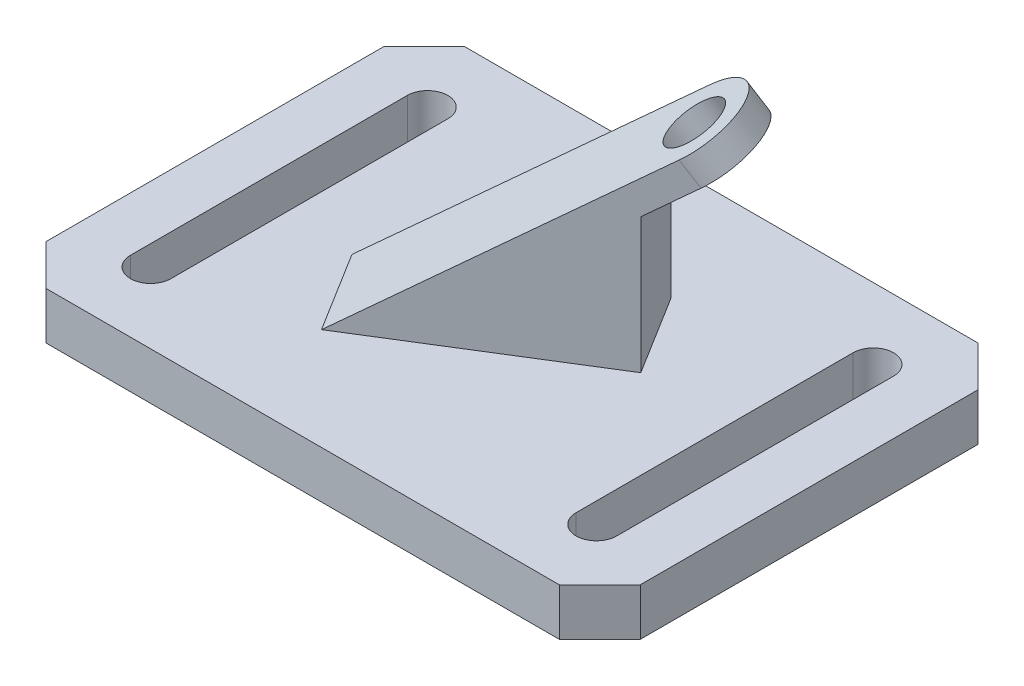
ISO-10303-21;
HEADER;
FILE_DESCRIPTION(('STEP AP214'),'2;1');
FILE_NAME('part.step','',(''),(''),'','','');
FILE_SCHEMA(('AUTOMOTIVE_DESIGN { 1 0 10303 214 1 1 1 1 }'));
ENDSEC;
DATA;
#1=APPLICATION_CONTEXT('core data for automotive mechanical design processes');
#2=APPLICATION_PROTOCOL_DEFINITION('international standard','automotive_design',2000,#1);
#3=PRODUCT_CONTEXT('',#1,'mechanical');
#4=PRODUCT('Part','Part','',(#3));
#5=PRODUCT_RELATED_PRODUCT_CATEGORY('part','',(#4));
#6=PRODUCT_DEFINITION_FORMATION('','',#4);
#7=PRODUCT_DEFINITION_CONTEXT('part definition',#1,'design');
#8=PRODUCT_DEFINITION('design','',#6,#7);
#9=PRODUCT_DEFINITION_SHAPE('','',#8);
#10=(LENGTH_UNIT() NAMED_UNIT(*) SI_UNIT(.MILLI.,.METRE.));
#11=(NAMED_UNIT(*) PLANE_ANGLE_UNIT() SI_UNIT($,.RADIAN.));
#12=(NAMED_UNIT(*) SI_UNIT($,.STERADIAN.) SOLID_ANGLE_UNIT());
#13=UNCERTAINTY_MEASURE_WITH_UNIT(LENGTH_MEASURE(1.E-05),#10,'distance_accuracy_value','');
#14=(GEOMETRIC_REPRESENTATION_CONTEXT(3) GLOBAL_UNCERTAINTY_ASSIGNED_CONTEXT((#13)) GLOBAL_UNIT_ASSIGNED_CONTEXT((#10,
#11,#12)) REPRESENTATION_CONTEXT('',''));
#15=CARTESIAN_POINT('',(0.,0.,0.));
#16=DIRECTION('',(0.,0.,1.));
#17=DIRECTION('',(1.,0.,0.));
#18=AXIS2_PLACEMENT_3D('',#15,#16,#17);
#19=CARTESIAN_POINT('',(0.,7.,0.));
#20=DIRECTION('',(0.,-1.,0.));
#21=DIRECTION('',(0.,0.,-1.));
#22=AXIS2_PLACEMENT_3D('',#19,#20,#21);
#23=PLANE('',#22);
#24=CARTESIAN_POINT('',(32.9999999999999,7.,20.5));
#25=DIRECTION('',(0.,1.,0.));
#26=DIRECTION('',(0.,0.,1.));
#27=AXIS2_PLACEMENT_3D('',#24,#25,#26);
#28=CIRCLE('',#27,3.);
#29=CARTESIAN_POINT('',(30.,7.,20.5));
#30=VERTEX_POINT('',#29);
#31=CARTESIAN_POINT('',(35.9999999999999,7.,20.5));
#32=VERTEX_POINT('',#31);
#33=EDGE_CURVE('E219',#30,#32,#28,.T.);
#34=ORIENTED_EDGE('',*,*,#33,.F.);
#35=DIRECTION('',(0.,0.,1.));
#36=VECTOR('',#35,1.);
#37=CARTESIAN_POINT('',(30.,7.,20.5));
#38=LINE('',#37,#36);
#39=CARTESIAN_POINT('',(30.,7.,-20.5));
#40=VERTEX_POINT('',#39);
#41=EDGE_CURVE('E227',#40,#30,#38,.T.);
#42=ORIENTED_EDGE('',*,*,#41,.F.);
#43=CARTESIAN_POINT('',(32.9999999999999,7.,-20.5));
#44=DIRECTION('',(0.,1.,0.));
#45=DIRECTION('',(0.,0.,1.));
#46=AXIS2_PLACEMENT_3D('',#43,#44,#45);
#47=CIRCLE('',#46,3.);
#48=CARTESIAN_POINT('',(35.9999999999999,7.,-20.5));
#49=VERTEX_POINT('',#48);
#50=EDGE_CURVE('E224',#49,#40,#47,.T.);
#51=ORIENTED_EDGE('',*,*,#50,.F.);
#52=DIRECTION('',(0.,0.,-1.));
#53=VECTOR('',#52,1.);
#54=CARTESIAN_POINT('',(35.9999999999999,7.,20.5));
#55=LINE('',#54,#53);
#56=EDGE_CURVE('E221',#32,#49,#55,.T.);
#57=ORIENTED_EDGE('',*,*,#56,.F.);
#58=EDGE_LOOP('',(#34,#42,#51,#57));
#59=FACE_BOUND('',#58,.T.);
#60=DIRECTION('',(-0.707106781186547,0.,0.707106781186548));
#61=VECTOR('',#60,1.);
#62=CARTESIAN_POINT('',(-38.,7.,-31.));
#63=LINE('',#62,#61);
#64=CARTESIAN_POINT('',(-38.,7.,-31.));
#65=VERTEX_POINT('',#64);
#66=CARTESIAN_POINT('',(-44.,7.,-25.));
#67=VERTEX_POINT('',#66);
#68=EDGE_CURVE('E281',#65,#67,#63,.T.);
#69=ORIENTED_EDGE('',*,*,#68,.T.);
#70=DIRECTION('',(0.,0.,1.));
#71=VECTOR('',#70,1.);
#72=CARTESIAN_POINT('',(-44.,7.,25.));
#73=LINE('',#72,#71);
#74=CARTESIAN_POINT('',(-44.,7.,25.));
#75=VERTEX_POINT('',#74);
#76=EDGE_CURVE('E284',#67,#75,#73,.T.);
#77=ORIENTED_EDGE('',*,*,#76,.T.);
#78=DIRECTION('',(0.707106781186548,0.,0.707106781186548));
#79=VECTOR('',#78,1.);
#80=CARTESIAN_POINT('',(-38.,7.,31.));
#81=LINE('',#80,#79);
#82=CARTESIAN_POINT('',(-38.,7.,31.));
#83=VERTEX_POINT('',#82);
#84=EDGE_CURVE('E287',#75,#83,#81,.T.);
#85=ORIENTED_EDGE('',*,*,#84,.T.);
#86=DIRECTION('',(1.,0.,0.));
#87=VECTOR('',#86,1.);
#88=CARTESIAN_POINT('',(38.,7.,31.));
#89=LINE('',#88,#87);
#90=CARTESIAN_POINT('',(38.,7.,31.));
#91=VERTEX_POINT('',#90);
#92=EDGE_CURVE('E289',#83,#91,#89,.T.);
#93=ORIENTED_EDGE('',*,*,#92,.T.);
#94=DIRECTION('',(0.707106781186548,0.,-0.707106781186548));
#95=VECTOR('',#94,1.);
#96=CARTESIAN_POINT('',(44.,7.,25.));
#97=LINE('',#96,#95);
#98=CARTESIAN_POINT('',(44.,7.,25.));
#99=VERTEX_POINT('',#98);
#100=EDGE_CURVE('E291',#91,#99,#97,.T.);
#101=ORIENTED_EDGE('',*,*,#100,.T.);
#102=DIRECTION('',(0.,0.,-1.));
#103=VECTOR('',#102,1.);
#104=CARTESIAN_POINT('',(44.,7.,25.));
#105=LINE('',#104,#103);
#106=CARTESIAN_POINT('',(44.,7.,-25.));
#107=VERTEX_POINT('',#106);
#108=EDGE_CURVE('E293',#99,#107,#105,.T.);
#109=ORIENTED_EDGE('',*,*,#108,.T.);
#110=DIRECTION('',(-0.707106781186547,0.,-0.707106781186548));
#111=VECTOR('',#110,1.);
#112=CARTESIAN_POINT('',(44.,7.,-25.));
#113=LINE('',#112,#111);
#114=CARTESIAN_POINT('',(38.,7.,-31.));
#115=VERTEX_POINT('',#114);
#116=EDGE_CURVE('E295',#107,#115,#113,.T.);
#117=ORIENTED_EDGE('',*,*,#116,.T.);
#118=DIRECTION('',(-1.,0.,0.));
#119=VECTOR('',#118,1.);
#120=CARTESIAN_POINT('',(38.,7.,-31.));
#121=LINE('',#120,#119);
#122=EDGE_CURVE('E297',#115,#65,#121,.T.);
#123=ORIENTED_EDGE('',*,*,#122,.T.);
#124=EDGE_LOOP('',(#69,#77,#85,#93,#101,#109,#117,#123));
#125=FACE_BOUND('',#124,.T.);
#126=CARTESIAN_POINT('',(-32.9999999999999,7.,20.5));
#127=DIRECTION('',(0.,1.,0.));
#128=DIRECTION('',(0.,0.,1.));
#129=AXIS2_PLACEMENT_3D('',#126,#127,#128);
#130=CIRCLE('',#129,3.);
#131=CARTESIAN_POINT('',(-35.9999999999999,7.,20.5));
#132=VERTEX_POINT('',#131);
#133=CARTESIAN_POINT('',(-29.9999999999999,7.,20.5));
#134=VERTEX_POINT('',#133);
#135=EDGE_CURVE('E250',#132,#134,#130,.T.);
#136=ORIENTED_EDGE('',*,*,#135,.F.);
#137=DIRECTION('',(0.,0.,1.));
#138=VECTOR('',#137,1.);
#139=CARTESIAN_POINT('',(-35.9999999999999,7.,20.5));
#140=LINE('',#139,#138);
#141=CARTESIAN_POINT('',(-35.9999999999999,7.,-20.5));
#142=VERTEX_POINT('',#141);
#143=EDGE_CURVE('E258',#142,#132,#140,.T.);
#144=ORIENTED_EDGE('',*,*,#143,.F.);
#145=CARTESIAN_POINT('',(-32.9999999999999,7.,-20.5));
#146=DIRECTION('',(0.,1.,0.));
#147=DIRECTION('',(0.,0.,1.));
#148=AXIS2_PLACEMENT_3D('',#145,#146,#147);
#149=CIRCLE('',#148,3.);
#150=CARTESIAN_POINT('',(-29.9999999999999,7.,-20.5));
#151=VERTEX_POINT('',#150);
#152=EDGE_CURVE('E255',#151,#142,#149,.T.);
#153=ORIENTED_EDGE('',*,*,#152,.F.);
#154=DIRECTION('',(0.,0.,-1.));
#155=VECTOR('',#154,1.);
#156=CARTESIAN_POINT('',(-29.9999999999999,7.,20.5));
#157=LINE('',#156,#155);
#158=EDGE_CURVE('E252',#134,#151,#157,.T.);
#159=ORIENTED_EDGE('',*,*,#158,.F.);
#160=EDGE_LOOP('',(#136,#144,#153,#159));
#161=FACE_BOUND('',#160,.T.);
#162=DIRECTION('',(-0.849441251034907,0.,0.527683201400474));
#163=VECTOR('',#162,1.);
#164=CARTESIAN_POINT('',(3.69378240980331,7.,5.94608875724435));
#165=LINE('',#164,#163);
#166=CARTESIAN_POINT('',(16.8463421337623,7.,-2.22444076824537));
#167=VERTEX_POINT('',#166);
#168=CARTESIAN_POINT('',(-12.3173925694994,7.,15.8924247292334));
#169=VERTEX_POINT('',#168);
#170=EDGE_CURVE('E50',#167,#169,#165,.T.);
#171=ORIENTED_EDGE('',*,*,#170,.T.);
#172=DIRECTION('',(-0.527683201400473,0.,-0.849441251034907));
#173=VECTOR('',#172,1.);
#174=CARTESIAN_POINT('',(-16.0111749793018,7.,9.94633597199053));
#175=LINE('',#174,#173);
#176=CARTESIAN_POINT('',(-19.7049573891061,7.,4.00024721474465));
#177=VERTEX_POINT('',#176);
#178=EDGE_CURVE('E11',#169,#177,#175,.T.);
#179=ORIENTED_EDGE('',*,*,#178,.T.);
#180=DIRECTION('',(-0.849441251034907,0.,0.527683201400474));
#181=VECTOR('',#180,1.);
#182=CARTESIAN_POINT('',(-3.69378240980331,7.,-5.94608875724435));
#183=LINE('',#182,#181);
#184=CARTESIAN_POINT('',(9.45877731415571,7.,-14.1166182827341));
#185=VERTEX_POINT('',#184);
#186=EDGE_CURVE('E58',#185,#177,#183,.T.);
#187=ORIENTED_EDGE('',*,*,#186,.F.);
#188=DIRECTION('',(-0.527683201400473,0.,-0.849441251034907));
#189=VECTOR('',#188,1.);
#190=CARTESIAN_POINT('',(16.8463421337623,7.,-2.22444076824537));
#191=LINE('',#190,#189);
#192=EDGE_CURVE('E210',#167,#185,#191,.T.);
#193=ORIENTED_EDGE('',*,*,#192,.F.);
#194=EDGE_LOOP('',(#171,#179,#187,#193));
#195=FACE_BOUND('',#194,.T.);
#196=ADVANCED_FACE('F36',(#59,#125,#161,#195),#23,.F.);
#197=CARTESIAN_POINT('',(0.,0.,0.));
#198=DIRECTION('',(0.,-1.,0.));
#199=DIRECTION('',(0.,0.,-1.));
#200=AXIS2_PLACEMENT_3D('',#197,#198,#199);
#201=PLANE('',#200);
#202=DIRECTION('',(-0.707106781186547,0.,0.707106781186548));
#203=VECTOR('',#202,1.);
#204=CARTESIAN_POINT('',(-38.,0.,-31.));
#205=LINE('',#204,#203);
#206=CARTESIAN_POINT('',(-38.,0.,-31.));
#207=VERTEX_POINT('',#206);
#208=CARTESIAN_POINT('',(-44.,0.,-25.));
#209=VERTEX_POINT('',#208);
#210=EDGE_CURVE('E280',#207,#209,#205,.T.);
#211=ORIENTED_EDGE('',*,*,#210,.F.);
#212=DIRECTION('',(-1.,0.,0.));
#213=VECTOR('',#212,1.);
#214=CARTESIAN_POINT('',(38.,0.,-31.));
#215=LINE('',#214,#213);
#216=CARTESIAN_POINT('',(38.,0.,-31.));
#217=VERTEX_POINT('',#216);
#218=EDGE_CURVE('E285',#217,#207,#215,.T.);
#219=ORIENTED_EDGE('',*,*,#218,.F.);
#220=DIRECTION('',(-0.707106781186547,0.,-0.707106781186548));
#221=VECTOR('',#220,1.);
#222=CARTESIAN_POINT('',(44.,0.,-25.));
#223=LINE('',#222,#221);
#224=CARTESIAN_POINT('',(44.,0.,-25.));
#225=VERTEX_POINT('',#224);
#226=EDGE_CURVE('E312',#225,#217,#223,.T.);
#227=ORIENTED_EDGE('',*,*,#226,.F.);
#228=DIRECTION('',(0.,0.,-1.));
#229=VECTOR('',#228,1.);
#230=CARTESIAN_POINT('',(44.,0.,25.));
#231=LINE('',#230,#229);
#232=CARTESIAN_POINT('',(44.,0.,25.));
#233=VERTEX_POINT('',#232);
#234=EDGE_CURVE('E310',#233,#225,#231,.T.);
#235=ORIENTED_EDGE('',*,*,#234,.F.);
#236=DIRECTION('',(0.707106781186548,0.,-0.707106781186548));
#237=VECTOR('',#236,1.);
#238=CARTESIAN_POINT('',(44.,0.,25.));
#239=LINE('',#238,#237);
#240=CARTESIAN_POINT('',(38.,0.,31.));
#241=VERTEX_POINT('',#240);
#242=EDGE_CURVE('E308',#241,#233,#239,.T.);
#243=ORIENTED_EDGE('',*,*,#242,.F.);
#244=DIRECTION('',(1.,0.,0.));
#245=VECTOR('',#244,1.);
#246=CARTESIAN_POINT('',(38.,0.,31.));
#247=LINE('',#246,#245);
#248=CARTESIAN_POINT('',(-38.,0.,31.));
#249=VERTEX_POINT('',#248);
#250=EDGE_CURVE('E306',#249,#241,#247,.T.);
#251=ORIENTED_EDGE('',*,*,#250,.F.);
#252=DIRECTION('',(0.707106781186548,0.,0.707106781186548));
#253=VECTOR('',#252,1.);
#254=CARTESIAN_POINT('',(-38.,0.,31.));
#255=LINE('',#254,#253);
#256=CARTESIAN_POINT('',(-44.,0.,25.));
#257=VERTEX_POINT('',#256);
#258=EDGE_CURVE('E304',#257,#249,#255,.T.);
#259=ORIENTED_EDGE('',*,*,#258,.F.);
#260=DIRECTION('',(0.,0.,1.));
#261=VECTOR('',#260,1.);
#262=CARTESIAN_POINT('',(-44.,0.,25.));
#263=LINE('',#262,#261);
#264=EDGE_CURVE('E302',#209,#257,#263,.T.);
#265=ORIENTED_EDGE('',*,*,#264,.F.);
#266=EDGE_LOOP('',(#211,#219,#227,#235,#243,#251,#259,#265));
#267=FACE_BOUND('',#266,.T.);
#268=DIRECTION('',(0.,0.,1.));
#269=VECTOR('',#268,1.);
#270=CARTESIAN_POINT('',(-35.9999999999999,0.,20.5));
#271=LINE('',#270,#269);
#272=CARTESIAN_POINT('',(-35.9999999999999,0.,-20.5));
#273=VERTEX_POINT('',#272);
#274=CARTESIAN_POINT('',(-35.9999999999999,0.,20.5));
#275=VERTEX_POINT('',#274);
#276=EDGE_CURVE('E253',#273,#275,#271,.T.);
#277=ORIENTED_EDGE('',*,*,#276,.T.);
#278=CARTESIAN_POINT('',(-32.9999999999999,0.,20.5));
#279=DIRECTION('',(0.,1.,0.));
#280=DIRECTION('',(0.,0.,1.));
#281=AXIS2_PLACEMENT_3D('',#278,#279,#280);
#282=CIRCLE('',#281,3.);
#283=CARTESIAN_POINT('',(-29.9999999999999,0.,20.5));
#284=VERTEX_POINT('',#283);
#285=EDGE_CURVE('E249',#275,#284,#282,.T.);
#286=ORIENTED_EDGE('',*,*,#285,.T.);
#287=DIRECTION('',(0.,0.,-1.));
#288=VECTOR('',#287,1.);
#289=CARTESIAN_POINT('',(-29.9999999999999,0.,20.5));
#290=LINE('',#289,#288);
#291=CARTESIAN_POINT('',(-29.9999999999999,0.,-20.5));
#292=VERTEX_POINT('',#291);
#293=EDGE_CURVE('E263',#284,#292,#290,.T.);
#294=ORIENTED_EDGE('',*,*,#293,.T.);
#295=CARTESIAN_POINT('',(-32.9999999999999,0.,-20.5));
#296=DIRECTION('',(0.,1.,0.));
#297=DIRECTION('',(0.,0.,1.));
#298=AXIS2_PLACEMENT_3D('',#295,#296,#297);
#299=CIRCLE('',#298,3.);
#300=EDGE_CURVE('E266',#292,#273,#299,.T.);
#301=ORIENTED_EDGE('',*,*,#300,.T.);
#302=EDGE_LOOP('',(#277,#286,#294,#301));
#303=FACE_BOUND('',#302,.T.);
#304=DIRECTION('',(0.,0.,1.));
#305=VECTOR('',#304,1.);
#306=CARTESIAN_POINT('',(30.,0.,20.5));
#307=LINE('',#306,#305);
#308=CARTESIAN_POINT('',(30.,0.,-20.5));
#309=VERTEX_POINT('',#308);
#310=CARTESIAN_POINT('',(30.,0.,20.5));
#311=VERTEX_POINT('',#310);
#312=EDGE_CURVE('E222',#309,#311,#307,.T.);
#313=ORIENTED_EDGE('',*,*,#312,.T.);
#314=CARTESIAN_POINT('',(32.9999999999999,0.,20.5));
#315=DIRECTION('',(0.,1.,0.));
#316=DIRECTION('',(0.,0.,1.));
#317=AXIS2_PLACEMENT_3D('',#314,#315,#316);
#318=CIRCLE('',#317,3.);
#319=CARTESIAN_POINT('',(35.9999999999999,0.,20.5));
#320=VERTEX_POINT('',#319);
#321=EDGE_CURVE('E218',#311,#320,#318,.T.);
#322=ORIENTED_EDGE('',*,*,#321,.T.);
#323=DIRECTION('',(0.,0.,-1.));
#324=VECTOR('',#323,1.);
#325=CARTESIAN_POINT('',(35.9999999999999,0.,20.5));
#326=LINE('',#325,#324);
#327=CARTESIAN_POINT('',(35.9999999999999,0.,-20.5));
#328=VERTEX_POINT('',#327);
#329=EDGE_CURVE('E232',#320,#328,#326,.T.);
#330=ORIENTED_EDGE('',*,*,#329,.T.);
#331=CARTESIAN_POINT('',(32.9999999999999,0.,-20.5));
#332=DIRECTION('',(0.,1.,0.));
#333=DIRECTION('',(0.,0.,1.));
#334=AXIS2_PLACEMENT_3D('',#331,#332,#333);
#335=CIRCLE('',#334,3.);
#336=EDGE_CURVE('E235',#328,#309,#335,.T.);
#337=ORIENTED_EDGE('',*,*,#336,.T.);
#338=EDGE_LOOP('',(#313,#322,#330,#337));
#339=FACE_BOUND('',#338,.T.);
#340=ADVANCED_FACE('F345',(#267,#303,#339),#201,.T.);
#341=CARTESIAN_POINT('',(-38.,7.,-31.));
#342=DIRECTION('',(0.707106781186548,0.,0.707106781186547));
#343=DIRECTION('',(0.707106781186547,0.,-0.707106781186548));
#344=AXIS2_PLACEMENT_3D('',#341,#342,#343);
#345=PLANE('',#344);
#346=ORIENTED_EDGE('',*,*,#210,.T.);
#347=DIRECTION('',(0.,-1.,0.));
#348=VECTOR('',#347,1.);
#349=CARTESIAN_POINT('',(-44.,7.,-25.));
#350=LINE('',#349,#348);
#351=EDGE_CURVE('E44',#67,#209,#350,.T.);
#352=ORIENTED_EDGE('',*,*,#351,.F.);
#353=ORIENTED_EDGE('',*,*,#68,.F.);
#354=DIRECTION('',(0.,-1.,0.));
#355=VECTOR('',#354,1.);
#356=CARTESIAN_POINT('',(-38.,7.,-31.));
#357=LINE('',#356,#355);
#358=EDGE_CURVE('E299',#65,#207,#357,.T.);
#359=ORIENTED_EDGE('',*,*,#358,.T.);
#360=EDGE_LOOP('',(#346,#352,#353,#359));
#361=FACE_BOUND('',#360,.T.);
#362=ADVANCED_FACE('F38',(#361),#345,.F.);
#363=CARTESIAN_POINT('',(-44.,7.,25.));
#364=DIRECTION('',(1.,0.,0.));
#365=DIRECTION('',(0.,0.,-1.));
#366=AXIS2_PLACEMENT_3D('',#363,#364,#365);
#367=PLANE('',#366);
#368=ORIENTED_EDGE('',*,*,#264,.T.);
#369=DIRECTION('',(0.,-1.,0.));
#370=VECTOR('',#369,1.);
#371=CARTESIAN_POINT('',(-44.,7.,25.));
#372=LINE('',#371,#370);
#373=EDGE_CURVE('E332',#75,#257,#372,.T.);
#374=ORIENTED_EDGE('',*,*,#373,.F.);
#375=ORIENTED_EDGE('',*,*,#76,.F.);
#376=ORIENTED_EDGE('',*,*,#351,.T.);
#377=EDGE_LOOP('',(#368,#374,#375,#376));
#378=FACE_BOUND('',#377,.T.);
#379=ADVANCED_FACE('F337',(#378),#367,.F.);
#380=CARTESIAN_POINT('',(-38.,7.,31.));
#381=DIRECTION('',(0.707106781186547,0.,-0.707106781186547));
#382=DIRECTION('',(-0.707106781186548,0.,-0.707106781186548));
#383=AXIS2_PLACEMENT_3D('',#380,#381,#382);
#384=PLANE('',#383);
#385=ORIENTED_EDGE('',*,*,#258,.T.);
#386=DIRECTION('',(0.,-1.,0.));
#387=VECTOR('',#386,1.);
#388=CARTESIAN_POINT('',(-38.,7.,31.));
#389=LINE('',#388,#387);
#390=EDGE_CURVE('E329',#83,#249,#389,.T.);
#391=ORIENTED_EDGE('',*,*,#390,.F.);
#392=ORIENTED_EDGE('',*,*,#84,.F.);
#393=ORIENTED_EDGE('',*,*,#373,.T.);
#394=EDGE_LOOP('',(#385,#391,#392,#393));
#395=FACE_BOUND('',#394,.T.);
#396=ADVANCED_FACE('F353',(#395),#384,.F.);
#397=CARTESIAN_POINT('',(38.,7.,31.));
#398=DIRECTION('',(0.,0.,-1.));
#399=DIRECTION('',(-1.,0.,0.));
#400=AXIS2_PLACEMENT_3D('',#397,#398,#399);
#401=PLANE('',#400);
#402=ORIENTED_EDGE('',*,*,#250,.T.);
#403=DIRECTION('',(0.,-1.,0.));
#404=VECTOR('',#403,1.);
#405=CARTESIAN_POINT('',(38.,7.,31.));
#406=LINE('',#405,#404);
#407=EDGE_CURVE('E326',#91,#241,#406,.T.);
#408=ORIENTED_EDGE('',*,*,#407,.F.);
#409=ORIENTED_EDGE('',*,*,#92,.F.);
#410=ORIENTED_EDGE('',*,*,#390,.T.);
#411=EDGE_LOOP('',(#402,#408,#409,#410));
#412=FACE_BOUND('',#411,.T.);
#413=ADVANCED_FACE('F357',(#412),#401,.F.);
#414=CARTESIAN_POINT('',(44.,7.,25.));
#415=DIRECTION('',(-0.707106781186547,0.,-0.707106781186547));
#416=DIRECTION('',(-0.707106781186548,0.,0.707106781186548));
#417=AXIS2_PLACEMENT_3D('',#414,#415,#416);
#418=PLANE('',#417);
#419=ORIENTED_EDGE('',*,*,#242,.T.);
#420=DIRECTION('',(0.,-1.,0.));
#421=VECTOR('',#420,1.);
#422=CARTESIAN_POINT('',(44.,7.,25.));
#423=LINE('',#422,#421);
#424=EDGE_CURVE('E323',#99,#233,#423,.T.);
#425=ORIENTED_EDGE('',*,*,#424,.F.);
#426=ORIENTED_EDGE('',*,*,#100,.F.);
#427=ORIENTED_EDGE('',*,*,#407,.T.);
#428=EDGE_LOOP('',(#419,#425,#426,#427));
#429=FACE_BOUND('',#428,.T.);
#430=ADVANCED_FACE('F376',(#429),#418,.F.);
#431=CARTESIAN_POINT('',(44.,7.,25.));
#432=DIRECTION('',(-1.,0.,0.));
#433=DIRECTION('',(0.,0.,1.));
#434=AXIS2_PLACEMENT_3D('',#431,#432,#433);
#435=PLANE('',#434);
#436=ORIENTED_EDGE('',*,*,#234,.T.);
#437=DIRECTION('',(0.,-1.,0.));
#438=VECTOR('',#437,1.);
#439=CARTESIAN_POINT('',(44.,7.,-25.));
#440=LINE('',#439,#438);
#441=EDGE_CURVE('E320',#107,#225,#440,.T.);
#442=ORIENTED_EDGE('',*,*,#441,.F.);
#443=ORIENTED_EDGE('',*,*,#108,.F.);
#444=ORIENTED_EDGE('',*,*,#424,.T.);
#445=EDGE_LOOP('',(#436,#442,#443,#444));
#446=FACE_BOUND('',#445,.T.);
#447=ADVANCED_FACE('F373',(#446),#435,.F.);
#448=CARTESIAN_POINT('',(44.,7.,-25.));
#449=DIRECTION('',(-0.707106781186548,0.,0.707106781186547));
#450=DIRECTION('',(0.707106781186547,0.,0.707106781186548));
#451=AXIS2_PLACEMENT_3D('',#448,#449,#450);
#452=PLANE('',#451);
#453=ORIENTED_EDGE('',*,*,#226,.T.);
#454=DIRECTION('',(0.,-1.,0.));
#455=VECTOR('',#454,1.);
#456=CARTESIAN_POINT('',(38.,7.,-31.));
#457=LINE('',#456,#455);
#458=EDGE_CURVE('E317',#115,#217,#457,.T.);
#459=ORIENTED_EDGE('',*,*,#458,.F.);
#460=ORIENTED_EDGE('',*,*,#116,.F.);
#461=ORIENTED_EDGE('',*,*,#441,.T.);
#462=EDGE_LOOP('',(#453,#459,#460,#461));
#463=FACE_BOUND('',#462,.T.);
#464=ADVANCED_FACE('F369',(#463),#452,.F.);
#465=CARTESIAN_POINT('',(38.,7.,-31.));
#466=DIRECTION('',(0.,0.,1.));
#467=DIRECTION('',(1.,0.,0.));
#468=AXIS2_PLACEMENT_3D('',#465,#466,#467);
#469=PLANE('',#468);
#470=ORIENTED_EDGE('',*,*,#218,.T.);
#471=ORIENTED_EDGE('',*,*,#358,.F.);
#472=ORIENTED_EDGE('',*,*,#122,.F.);
#473=ORIENTED_EDGE('',*,*,#458,.T.);
#474=EDGE_LOOP('',(#470,#471,#472,#473));
#475=FACE_BOUND('',#474,.T.);
#476=ADVANCED_FACE('F367',(#475),#469,.F.);
#477=CARTESIAN_POINT('',(-32.9999999999999,7.,20.5));
#478=DIRECTION('',(0.,-1.,0.));
#479=DIRECTION('',(0.,0.,-1.));
#480=AXIS2_PLACEMENT_3D('',#477,#478,#479);
#481=CYLINDRICAL_SURFACE('',#480,3.);
#482=ORIENTED_EDGE('',*,*,#285,.F.);
#483=DIRECTION('',(0.,-1.,0.));
#484=VECTOR('',#483,1.);
#485=CARTESIAN_POINT('',(-35.9999999999999,7.,20.5));
#486=LINE('',#485,#484);
#487=EDGE_CURVE('E260',#132,#275,#486,.T.);
#488=ORIENTED_EDGE('',*,*,#487,.F.);
#489=ORIENTED_EDGE('',*,*,#135,.T.);
#490=DIRECTION('',(0.,-1.,0.));
#491=VECTOR('',#490,1.);
#492=CARTESIAN_POINT('',(-29.9999999999999,7.,20.5));
#493=LINE('',#492,#491);
#494=EDGE_CURVE('E277',#134,#284,#493,.T.);
#495=ORIENTED_EDGE('',*,*,#494,.T.);
#496=EDGE_LOOP('',(#482,#488,#489,#495));
#497=FACE_BOUND('',#496,.T.);
#498=ADVANCED_FACE('F394',(#497),#481,.F.);
#499=CARTESIAN_POINT('',(-29.9999999999999,7.,20.5));
#500=DIRECTION('',(-1.,0.,0.));
#501=DIRECTION('',(0.,0.,1.));
#502=AXIS2_PLACEMENT_3D('',#499,#500,#501);
#503=PLANE('',#502);
#504=ORIENTED_EDGE('',*,*,#293,.F.);
#505=ORIENTED_EDGE('',*,*,#494,.F.);
#506=ORIENTED_EDGE('',*,*,#158,.T.);
#507=DIRECTION('',(0.,-1.,0.));
#508=VECTOR('',#507,1.);
#509=CARTESIAN_POINT('',(-29.9999999999999,7.,-20.5));
#510=LINE('',#509,#508);
#511=EDGE_CURVE('E275',#151,#292,#510,.T.);
#512=ORIENTED_EDGE('',*,*,#511,.T.);
#513=EDGE_LOOP('',(#504,#505,#506,#512));
#514=FACE_BOUND('',#513,.T.);
#515=ADVANCED_FACE('F414',(#514),#503,.T.);
#516=CARTESIAN_POINT('',(-32.9999999999999,7.,-20.5));
#517=DIRECTION('',(0.,-1.,0.));
#518=DIRECTION('',(0.,0.,-1.));
#519=AXIS2_PLACEMENT_3D('',#516,#517,#518);
#520=CYLINDRICAL_SURFACE('',#519,3.);
#521=ORIENTED_EDGE('',*,*,#300,.F.);
#522=ORIENTED_EDGE('',*,*,#511,.F.);
#523=ORIENTED_EDGE('',*,*,#152,.T.);
#524=DIRECTION('',(0.,-1.,0.));
#525=VECTOR('',#524,1.);
#526=CARTESIAN_POINT('',(-35.9999999999999,7.,-20.5));
#527=LINE('',#526,#525);
#528=EDGE_CURVE('E273',#142,#273,#527,.T.);
#529=ORIENTED_EDGE('',*,*,#528,.T.);
#530=EDGE_LOOP('',(#521,#522,#523,#529));
#531=FACE_BOUND('',#530,.T.);
#532=ADVANCED_FACE('F421',(#531),#520,.F.);
#533=CARTESIAN_POINT('',(-35.9999999999999,7.,20.5));
#534=DIRECTION('',(1.,0.,0.));
#535=DIRECTION('',(0.,0.,-1.));
#536=AXIS2_PLACEMENT_3D('',#533,#534,#535);
#537=PLANE('',#536);
#538=ORIENTED_EDGE('',*,*,#276,.F.);
#539=ORIENTED_EDGE('',*,*,#528,.F.);
#540=ORIENTED_EDGE('',*,*,#143,.T.);
#541=ORIENTED_EDGE('',*,*,#487,.T.);
#542=EDGE_LOOP('',(#538,#539,#540,#541));
#543=FACE_BOUND('',#542,.T.);
#544=ADVANCED_FACE('F428',(#543),#537,.T.);
#545=CARTESIAN_POINT('',(32.9999999999999,7.,20.5));
#546=DIRECTION('',(0.,-1.,0.));
#547=DIRECTION('',(0.,0.,-1.));
#548=AXIS2_PLACEMENT_3D('',#545,#546,#547);
#549=CYLINDRICAL_SURFACE('',#548,3.);
#550=ORIENTED_EDGE('',*,*,#321,.F.);
#551=DIRECTION('',(0.,-1.,0.));
#552=VECTOR('',#551,1.);
#553=CARTESIAN_POINT('',(30.,7.,20.5));
#554=LINE('',#553,#552);
#555=EDGE_CURVE('E229',#30,#311,#554,.T.);
#556=ORIENTED_EDGE('',*,*,#555,.F.);
#557=ORIENTED_EDGE('',*,*,#33,.T.);
#558=DIRECTION('',(0.,-1.,0.));
#559=VECTOR('',#558,1.);
#560=CARTESIAN_POINT('',(35.9999999999999,7.,20.5));
#561=LINE('',#560,#559);
#562=EDGE_CURVE('E246',#32,#320,#561,.T.);
#563=ORIENTED_EDGE('',*,*,#562,.T.);
#564=EDGE_LOOP('',(#550,#556,#557,#563));
#565=FACE_BOUND('',#564,.T.);
#566=ADVANCED_FACE('F436',(#565),#549,.F.);
#567=CARTESIAN_POINT('',(35.9999999999999,7.,20.5));
#568=DIRECTION('',(-1.,0.,0.));
#569=DIRECTION('',(0.,0.,1.));
#570=AXIS2_PLACEMENT_3D('',#567,#568,#569);
#571=PLANE('',#570);
#572=ORIENTED_EDGE('',*,*,#329,.F.);
#573=ORIENTED_EDGE('',*,*,#562,.F.);
#574=ORIENTED_EDGE('',*,*,#56,.T.);
#575=DIRECTION('',(0.,-1.,0.));
#576=VECTOR('',#575,1.);
#577=CARTESIAN_POINT('',(35.9999999999999,7.,-20.5));
#578=LINE('',#577,#576);
#579=EDGE_CURVE('E244',#49,#328,#578,.T.);
#580=ORIENTED_EDGE('',*,*,#579,.T.);
#581=EDGE_LOOP('',(#572,#573,#574,#580));
#582=FACE_BOUND('',#581,.T.);
#583=ADVANCED_FACE('F444',(#582),#571,.T.);
#584=CARTESIAN_POINT('',(32.9999999999999,7.,-20.5));
#585=DIRECTION('',(0.,-1.,0.));
#586=DIRECTION('',(0.,0.,-1.));
#587=AXIS2_PLACEMENT_3D('',#584,#585,#586);
#588=CYLINDRICAL_SURFACE('',#587,3.);
#589=ORIENTED_EDGE('',*,*,#336,.F.);
#590=ORIENTED_EDGE('',*,*,#579,.F.);
#591=ORIENTED_EDGE('',*,*,#50,.T.);
#592=DIRECTION('',(0.,-1.,0.));
#593=VECTOR('',#592,1.);
#594=CARTESIAN_POINT('',(30.,7.,-20.5));
#595=LINE('',#594,#593);
#596=EDGE_CURVE('E242',#40,#309,#595,.T.);
#597=ORIENTED_EDGE('',*,*,#596,.T.);
#598=EDGE_LOOP('',(#589,#590,#591,#597));
#599=FACE_BOUND('',#598,.T.);
#600=ADVANCED_FACE('F452',(#599),#588,.F.);
#601=CARTESIAN_POINT('',(30.,7.,20.5));
#602=DIRECTION('',(1.,0.,0.));
#603=DIRECTION('',(0.,0.,-1.));
#604=AXIS2_PLACEMENT_3D('',#601,#602,#603);
#605=PLANE('',#604);
#606=ORIENTED_EDGE('',*,*,#312,.F.);
#607=ORIENTED_EDGE('',*,*,#596,.F.);
#608=ORIENTED_EDGE('',*,*,#41,.T.);
#609=ORIENTED_EDGE('',*,*,#555,.T.);
#610=EDGE_LOOP('',(#606,#607,#608,#609));
#611=FACE_BOUND('',#610,.T.);
#612=ADVANCED_FACE('F460',(#611),#605,.T.);
#613=CARTESIAN_POINT('',(16.8463421337623,0.,-2.22444076824537));
#614=DIRECTION('',(0.849441251034907,0.,-0.527683201400473));
#615=DIRECTION('',(-0.527683201400474,0.,-0.849441251034907));
#616=AXIS2_PLACEMENT_3D('',#613,#614,#615);
#617=PLANE('',#616);
#618=DIRECTION('',(0.,-1.,0.));
#619=VECTOR('',#618,1.);
#620=CARTESIAN_POINT('',(9.45877731415571,0.,-14.1166182827341));
#621=LINE('',#620,#619);
#622=CARTESIAN_POINT('',(9.45877731415571,27.,-14.1166182827341));
#623=VERTEX_POINT('',#622);
#624=EDGE_CURVE('E201',#623,#185,#621,.T.);
#625=ORIENTED_EDGE('',*,*,#624,.F.);
#626=DIRECTION('',(-0.527683201400473,0.,-0.849441251034907));
#627=VECTOR('',#626,1.);
#628=CARTESIAN_POINT('',(16.8463421337623,27.,-2.22444076824537));
#629=LINE('',#628,#627);
#630=CARTESIAN_POINT('',(16.8463421337623,27.,-2.22444076824537));
#631=VERTEX_POINT('',#630);
#632=EDGE_CURVE('E215',#631,#623,#629,.T.);
#633=ORIENTED_EDGE('',*,*,#632,.F.);
#634=DIRECTION('',(0.,-1.,0.));
#635=VECTOR('',#634,1.);
#636=CARTESIAN_POINT('',(16.8463421337623,0.,-2.22444076824537));
#637=LINE('',#636,#635);
#638=EDGE_CURVE('E207',#631,#167,#637,.T.);
#639=ORIENTED_EDGE('',*,*,#638,.T.);
#640=ORIENTED_EDGE('',*,*,#192,.T.);
#641=EDGE_LOOP('',(#625,#633,#639,#640));
#642=FACE_BOUND('',#641,.T.);
#643=ADVANCED_FACE('F468',(#642),#617,.T.);
#644=CARTESIAN_POINT('',(3.69378240980331,0.,5.94608875724435));
#645=DIRECTION('',(0.527683201400474,0.,0.849441251034907));
#646=DIRECTION('',(0.849441251034907,0.,-0.527683201400474));
#647=AXIS2_PLACEMENT_3D('',#644,#645,#646);
#648=PLANE('',#647);
#649=ORIENTED_EDGE('',*,*,#638,.F.);
#650=DIRECTION('',(0.687212407810358,0.587785252292469,-0.426904677579163));
#651=VECTOR('',#650,1.);
#652=CARTESIAN_POINT('',(-10.6600439216382,3.47328848624519,14.8628596601075));
#653=LINE('',#652,#651);
#654=CARTESIAN_POINT('',(22.3440413962417,31.7022820183398,-5.63967818888426));
#655=VERTEX_POINT('',#654);
#656=EDGE_CURVE('E199',#631,#655,#653,.T.);
#657=ORIENTED_EDGE('',*,*,#656,.T.);
#658=DIRECTION('',(0.499289040047183,-0.809016994374951,-0.310164403665675));
#659=VECTOR('',#658,1.);
#660=CARTESIAN_POINT('',(20.346885236053,34.9383499958396,-4.39902057422156));
#661=LINE('',#660,#659);
#662=CARTESIAN_POINT('',(20.346885236053,34.9383499958396,-4.39902057422156));
#663=VERTEX_POINT('',#662);
#664=EDGE_CURVE('E191',#663,#655,#661,.T.);
#665=ORIENTED_EDGE('',*,*,#664,.F.);
#666=DIRECTION('',(0.687212407810358,0.587785252292469,-0.426904677579163));
#667=VECTOR('',#666,1.);
#668=CARTESIAN_POINT('',(-12.657200081827,6.70935646374499,16.1035172747702));
#669=LINE('',#668,#667);
#670=EDGE_CURVE('E178',#169,#663,#669,.T.);
#671=ORIENTED_EDGE('',*,*,#670,.F.);
#672=ORIENTED_EDGE('',*,*,#170,.F.);
#673=EDGE_LOOP('',(#649,#657,#665,#671,#672));
#674=FACE_BOUND('',#673,.T.);
#675=ADVANCED_FACE('F197',(#674),#648,.T.);
#676=CARTESIAN_POINT('',(-3.69378240980331,0.,-5.94608875724435));
#677=DIRECTION('',(0.527683201400474,0.,0.849441251034907));
#678=DIRECTION('',(0.849441251034907,0.,-0.527683201400474));
#679=AXIS2_PLACEMENT_3D('',#676,#677,#678);
#680=PLANE('',#679);
#681=ORIENTED_EDGE('',*,*,#624,.T.);
#682=ORIENTED_EDGE('',*,*,#186,.T.);
#683=DIRECTION('',(-0.687212407810358,-0.587785252292469,0.426904677579163));
#684=VECTOR('',#683,1.);
#685=CARTESIAN_POINT('',(-20.0447649014336,6.70935646374499,4.21133976028146));
#686=LINE('',#685,#684);
#687=CARTESIAN_POINT('',(12.9593204164489,34.9383499958396,-16.2911980887062));
#688=VERTEX_POINT('',#687);
#689=EDGE_CURVE('E194',#688,#177,#686,.T.);
#690=ORIENTED_EDGE('',*,*,#689,.F.);
#691=DIRECTION('',(0.499289040047183,-0.809016994374951,-0.310164403665675));
#692=VECTOR('',#691,1.);
#693=CARTESIAN_POINT('',(12.9593204164489,34.9383499958396,-16.2911980887062));
#694=LINE('',#693,#692);
#695=CARTESIAN_POINT('',(14.9564765766376,31.7022820183398,-17.5318557033689));
#696=VERTEX_POINT('',#695);
#697=EDGE_CURVE('E193',#688,#696,#694,.T.);
#698=ORIENTED_EDGE('',*,*,#697,.T.);
#699=DIRECTION('',(-0.687212407810358,-0.587785252292469,0.426904677579163));
#700=VECTOR('',#699,1.);
#701=CARTESIAN_POINT('',(-18.0476087412449,3.47328848624519,2.97068214561876));
#702=LINE('',#701,#700);
#703=EDGE_CURVE('E186',#696,#623,#702,.T.);
#704=ORIENTED_EDGE('',*,*,#703,.T.);
#705=EDGE_LOOP('',(#681,#682,#690,#698,#704));
#706=FACE_BOUND('',#705,.T.);
#707=ADVANCED_FACE('F483',(#706),#680,.F.);
#708=CARTESIAN_POINT('',(16.6531028262497,34.9383499958396,-10.3451093314659));
#709=DIRECTION('',(-0.499289040047183,0.809016994374951,0.310164403665675));
#710=DIRECTION('',(-0.850985081019819,-0.525189862698903,0.));
#711=AXIS2_PLACEMENT_3D('',#708,#709,#710);
#712=PLANE('',#711);
#713=CARTESIAN_POINT('',(16.6531028262497,34.9383499958396,-10.3451093314659));
#714=DIRECTION('',(-0.499289040047183,0.809016994374951,0.310164403665675));
#715=DIRECTION('',(-0.850985081019819,-0.525189862698903,0.));
#716=AXIS2_PLACEMENT_3D('',#713,#714,#715);
#717=CIRCLE('',#716,3.99999999999996);
#718=CARTESIAN_POINT('',(13.2491625021704,32.837590545044,-10.3451093314659));
#719=VERTEX_POINT('',#718);
#720=EDGE_CURVE('E610',#719,#719,#717,.T.);
#721=ORIENTED_EDGE('',*,*,#720,.F.);
#722=EDGE_LOOP('',(#721));
#723=FACE_BOUND('',#722,.T.);
#724=ORIENTED_EDGE('',*,*,#178,.F.);
#725=ORIENTED_EDGE('',*,*,#670,.T.);
#726=CARTESIAN_POINT('',(16.6531028262497,34.9383499958396,-10.3451093314659));
#727=DIRECTION('',(-0.499289040047183,0.809016994374951,0.310164403665675));
#728=DIRECTION('',(-0.850985081019819,-0.525189862698903,0.));
#729=AXIS2_PLACEMENT_3D('',#726,#727,#728);
#730=CIRCLE('',#729,7.00000000000002);
#731=EDGE_CURVE('E182',#663,#688,#730,.T.);
#732=ORIENTED_EDGE('',*,*,#731,.T.);
#733=ORIENTED_EDGE('',*,*,#689,.T.);
#734=EDGE_LOOP('',(#724,#725,#732,#733));
#735=FACE_BOUND('',#734,.T.);
#736=ADVANCED_FACE('F180',(#723,#735),#712,.T.);
#737=CARTESIAN_POINT('',(18.6502589864384,31.7022820183398,-11.5857669461286));
#738=DIRECTION('',(-0.499289040047183,0.809016994374951,0.310164403665675));
#739=DIRECTION('',(-0.850985081019819,-0.525189862698903,0.));
#740=AXIS2_PLACEMENT_3D('',#737,#738,#739);
#741=PLANE('',#740);
#742=ORIENTED_EDGE('',*,*,#632,.T.);
#743=ORIENTED_EDGE('',*,*,#703,.F.);
#744=CARTESIAN_POINT('',(18.6502589864384,31.7022820183398,-11.5857669461286));
#745=DIRECTION('',(-0.499289040047183,0.809016994374951,0.310164403665675));
#746=DIRECTION('',(-0.850985081019819,-0.525189862698903,0.));
#747=AXIS2_PLACEMENT_3D('',#744,#745,#746);
#748=CIRCLE('',#747,7.00000000000002);
#749=EDGE_CURVE('E620',#655,#696,#748,.T.);
#750=ORIENTED_EDGE('',*,*,#749,.F.);
#751=ORIENTED_EDGE('',*,*,#656,.F.);
#752=EDGE_LOOP('',(#742,#743,#750,#751));
#753=FACE_BOUND('',#752,.T.);
#754=CARTESIAN_POINT('',(18.6502589864384,31.7022820183398,-11.5857669461286));
#755=DIRECTION('',(-0.499289040047183,0.809016994374951,0.310164403665675));
#756=DIRECTION('',(-0.850985081019819,-0.525189862698903,0.));
#757=AXIS2_PLACEMENT_3D('',#754,#755,#756);
#758=CIRCLE('',#757,3.99999999999996);
#759=CARTESIAN_POINT('',(15.2463186623592,29.6015225675442,-11.5857669461286));
#760=VERTEX_POINT('',#759);
#761=EDGE_CURVE('E613',#760,#760,#758,.T.);
#762=ORIENTED_EDGE('',*,*,#761,.T.);
#763=EDGE_LOOP('',(#762));
#764=FACE_BOUND('',#763,.T.);
#765=ADVANCED_FACE('F496',(#753,#764),#741,.F.);
#766=CARTESIAN_POINT('',(16.6531028262497,34.9383499958396,-10.3451093314659));
#767=DIRECTION('',(0.499289040047183,-0.809016994374951,-0.310164403665675));
#768=DIRECTION('',(0.850985081019819,0.525189862698903,0.));
#769=AXIS2_PLACEMENT_3D('',#766,#767,#768);
#770=CYLINDRICAL_SURFACE('',#769,7.00000000000002);
#771=ORIENTED_EDGE('',*,*,#749,.T.);
#772=ORIENTED_EDGE('',*,*,#697,.F.);
#773=ORIENTED_EDGE('',*,*,#731,.F.);
#774=ORIENTED_EDGE('',*,*,#664,.T.);
#775=EDGE_LOOP('',(#771,#772,#773,#774));
#776=FACE_BOUND('',#775,.T.);
#777=ADVANCED_FACE('F190',(#776),#770,.T.);
#778=CARTESIAN_POINT('',(16.6531028262497,34.9383499958396,-10.3451093314659));
#779=DIRECTION('',(0.499289040047183,-0.809016994374951,-0.310164403665675));
#780=DIRECTION('',(0.850985081019819,0.525189862698903,0.));
#781=AXIS2_PLACEMENT_3D('',#778,#779,#780);
#782=CYLINDRICAL_SURFACE('',#781,3.99999999999996);
#783=ORIENTED_EDGE('',*,*,#720,.T.);
#784=EDGE_LOOP('',(#783));
#785=FACE_BOUND('',#784,.T.);
#786=ORIENTED_EDGE('',*,*,#761,.F.);
#787=EDGE_LOOP('',(#786));
#788=FACE_BOUND('',#787,.T.);
#789=ADVANCED_FACE('F511',(#785,#788),#782,.F.);
#790=CLOSED_SHELL('',(#196,#340,#362,#379,#396,#413,#430,#447,#464,#476,#498,#515,#532,#544,
#566,#583,#600,#612,#643,#675,#707,#736,#765,#777,#789));
#791=MANIFOLD_SOLID_BREP('B2',#790);
#792=ADVANCED_BREP_SHAPE_REPRESENTATION('',(#18,#791),#14);
#793=SHAPE_DEFINITION_REPRESENTATION(#9,#792);
ENDSEC;
END-ISO-10303-21;
